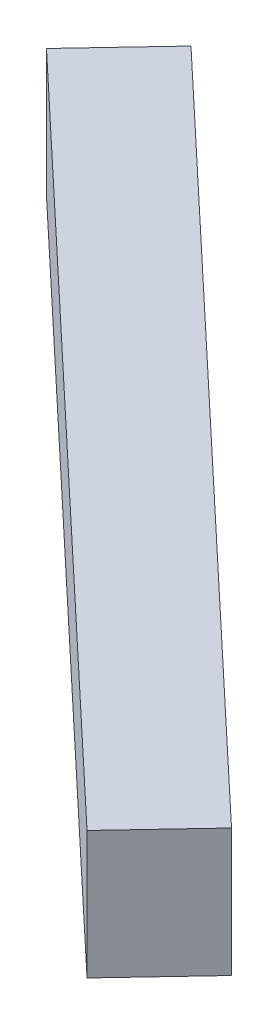
ISO-10303-21;
HEADER;
FILE_DESCRIPTION(('STEP AP214'),'2;1');
FILE_NAME('part.step','',(''),(''),'','','');
FILE_SCHEMA(('AUTOMOTIVE_DESIGN { 1 0 10303 214 1 1 1 1 }'));
ENDSEC;
DATA;
#1=APPLICATION_CONTEXT('core data for automotive mechanical design processes');
#2=APPLICATION_PROTOCOL_DEFINITION('international standard','automotive_design',2000,#1);
#3=PRODUCT_CONTEXT('',#1,'mechanical');
#4=PRODUCT('Part','Part','',(#3));
#5=PRODUCT_RELATED_PRODUCT_CATEGORY('part','',(#4));
#6=PRODUCT_DEFINITION_FORMATION('','',#4);
#7=PRODUCT_DEFINITION_CONTEXT('part definition',#1,'design');
#8=PRODUCT_DEFINITION('design','',#6,#7);
#9=PRODUCT_DEFINITION_SHAPE('','',#8);
#10=(LENGTH_UNIT() NAMED_UNIT(*) SI_UNIT(.MILLI.,.METRE.));
#11=(NAMED_UNIT(*) PLANE_ANGLE_UNIT() SI_UNIT($,.RADIAN.));
#12=(NAMED_UNIT(*) SI_UNIT($,.STERADIAN.) SOLID_ANGLE_UNIT());
#13=UNCERTAINTY_MEASURE_WITH_UNIT(LENGTH_MEASURE(1.E-05),#10,'distance_accuracy_value','');
#14=(GEOMETRIC_REPRESENTATION_CONTEXT(3) GLOBAL_UNCERTAINTY_ASSIGNED_CONTEXT((#13)) GLOBAL_UNIT_ASSIGNED_CONTEXT((#10,
#11,#12)) REPRESENTATION_CONTEXT('',''));
#15=CARTESIAN_POINT('',(0.,0.,0.));
#16=DIRECTION('',(0.,0.,1.));
#17=DIRECTION('',(1.,0.,0.));
#18=AXIS2_PLACEMENT_3D('',#15,#16,#17);
#19=CARTESIAN_POINT('',(-13.1693987770716,7.874,-12.2659159191959));
#20=DIRECTION('',(0.685632034006956,0.,-0.727948290707166));
#21=DIRECTION('',(-0.727948290707166,0.,-0.685632034006956));
#22=AXIS2_PLACEMENT_3D('',#19,#20,#21);
#23=PLANE('',#22);
#24=DIRECTION('',(0.,1.,0.));
#25=VECTOR('',#24,1.);
#26=CARTESIAN_POINT('',(-13.1693987770716,7.874,-12.2659159191959));
#27=LINE('',#26,#25);
#28=CARTESIAN_POINT('',(-13.1693987770716,7.62,-12.2659159191959));
#29=VERTEX_POINT('',#28);
#30=CARTESIAN_POINT('',(-13.1693987770716,7.874,-12.2659159191959));
#31=VERTEX_POINT('',#30);
#32=EDGE_CURVE('E20',#29,#31,#27,.T.);
#33=ORIENTED_EDGE('',*,*,#32,.T.);
#34=DIRECTION('',(-0.727948290707165,0.,-0.685632034006957));
#35=VECTOR('',#34,1.);
#36=CARTESIAN_POINT('',(-13.1693987770716,7.874,-12.2659159191959));
#37=LINE('',#36,#35);
#38=CARTESIAN_POINT('',(-14.5561402708688,7.874,-13.5720449439792));
#39=VERTEX_POINT('',#38);
#40=EDGE_CURVE('E55',#31,#39,#37,.T.);
#41=ORIENTED_EDGE('',*,*,#40,.T.);
#42=DIRECTION('',(0.,1.,0.));
#43=VECTOR('',#42,1.);
#44=CARTESIAN_POINT('',(-14.5561402708688,7.874,-13.5720449439792));
#45=LINE('',#44,#43);
#46=CARTESIAN_POINT('',(-14.5561402708688,7.62,-13.5720449439792));
#47=VERTEX_POINT('',#46);
#48=EDGE_CURVE('E76',#39,#47,#45,.F.);
#49=ORIENTED_EDGE('',*,*,#48,.T.);
#50=DIRECTION('',(-0.727948290707165,0.,-0.685632034006957));
#51=VECTOR('',#50,1.);
#52=CARTESIAN_POINT('',(-13.1693987770716,7.62,-12.2659159191959));
#53=LINE('',#52,#51);
#54=EDGE_CURVE('E58',#29,#47,#53,.T.);
#55=ORIENTED_EDGE('',*,*,#54,.F.);
#56=EDGE_LOOP('',(#33,#41,#49,#55));
#57=FACE_BOUND('',#56,.T.);
#58=ADVANCED_FACE('F17',(#57),#23,.F.);
#59=CARTESIAN_POINT('',(-13.1693987770716,7.874,-12.2659159191959));
#60=DIRECTION('',(-0.727948290707194,0.,-0.685632034006926));
#61=DIRECTION('',(-0.685632034006926,0.,0.727948290707194));
#62=AXIS2_PLACEMENT_3D('',#59,#60,#61);
#63=PLANE('',#62);
#64=DIRECTION('',(0.,1.,0.));
#65=VECTOR('',#64,1.);
#66=CARTESIAN_POINT('',(-13.0300783477614,7.874,-12.4138350118676));
#67=LINE('',#66,#65);
#68=CARTESIAN_POINT('',(-13.0300783477614,7.62,-12.4138350118676));
#69=VERTEX_POINT('',#68);
#70=CARTESIAN_POINT('',(-13.0300783477614,7.874,-12.4138350118676));
#71=VERTEX_POINT('',#70);
#72=EDGE_CURVE('E73',#69,#71,#67,.T.);
#73=ORIENTED_EDGE('',*,*,#72,.T.);
#74=DIRECTION('',(-0.685632034006912,0.,0.727948290707207));
#75=VECTOR('',#74,1.);
#76=CARTESIAN_POINT('',(-13.0300783477614,7.874,-12.4138350118676));
#77=LINE('',#76,#75);
#78=EDGE_CURVE('E63',#71,#31,#77,.T.);
#79=ORIENTED_EDGE('',*,*,#78,.T.);
#80=ORIENTED_EDGE('',*,*,#32,.F.);
#81=DIRECTION('',(-0.685632034006912,0.,0.727948290707207));
#82=VECTOR('',#81,1.);
#83=CARTESIAN_POINT('',(-13.0300783477614,7.62,-12.4138350118676));
#84=LINE('',#83,#82);
#85=EDGE_CURVE('E80',#69,#29,#84,.T.);
#86=ORIENTED_EDGE('',*,*,#85,.F.);
#87=EDGE_LOOP('',(#73,#79,#80,#86));
#88=FACE_BOUND('',#87,.T.);
#89=ADVANCED_FACE('F72',(#88),#63,.F.);
#90=CARTESIAN_POINT('',(-13.1693987770716,7.874,-12.2659159191959));
#91=DIRECTION('',(0.,-1.,0.));
#92=DIRECTION('',(0.,0.,-1.));
#93=AXIS2_PLACEMENT_3D('',#90,#91,#92);
#94=PLANE('',#93);
#95=ORIENTED_EDGE('',*,*,#78,.F.);
#96=DIRECTION('',(0.727948290707166,0.,0.685632034006955));
#97=VECTOR('',#96,1.);
#98=CARTESIAN_POINT('',(-13.0300783477614,7.874,-12.4138350118676));
#99=LINE('',#98,#97);
#100=CARTESIAN_POINT('',(-14.4168198417837,7.874,-13.719964036863));
#101=VERTEX_POINT('',#100);
#102=EDGE_CURVE('E83',#71,#101,#99,.F.);
#103=ORIENTED_EDGE('',*,*,#102,.T.);
#104=DIRECTION('',(0.685632032898792,0.,-0.727948291750911));
#105=VECTOR('',#104,1.);
#106=CARTESIAN_POINT('',(-14.5561402708688,7.874,-13.5720449439792));
#107=LINE('',#106,#105);
#108=EDGE_CURVE('E69',#101,#39,#107,.F.);
#109=ORIENTED_EDGE('',*,*,#108,.T.);
#110=ORIENTED_EDGE('',*,*,#40,.F.);
#111=EDGE_LOOP('',(#95,#103,#109,#110));
#112=FACE_BOUND('',#111,.T.);
#113=ADVANCED_FACE('F66',(#112),#94,.F.);
#114=CARTESIAN_POINT('',(-14.5561402708688,7.874,-13.5720449439792));
#115=DIRECTION('',(0.727948291750911,0.,0.685632032898792));
#116=DIRECTION('',(0.685632032898792,0.,-0.727948291750911));
#117=AXIS2_PLACEMENT_3D('',#114,#115,#116);
#118=PLANE('',#117);
#119=ORIENTED_EDGE('',*,*,#48,.F.);
#120=ORIENTED_EDGE('',*,*,#108,.F.);
#121=DIRECTION('',(0.,1.,0.));
#122=VECTOR('',#121,1.);
#123=CARTESIAN_POINT('',(-14.4168198417837,7.874,-13.719964036863));
#124=LINE('',#123,#122);
#125=CARTESIAN_POINT('',(-14.4168198417837,7.62,-13.719964036863));
#126=VERTEX_POINT('',#125);
#127=EDGE_CURVE('E26',#101,#126,#124,.F.);
#128=ORIENTED_EDGE('',*,*,#127,.T.);
#129=DIRECTION('',(0.685632032898921,0.,-0.72794829175079));
#130=VECTOR('',#129,1.);
#131=CARTESIAN_POINT('',(-14.5561402708688,7.62,-13.5720449439792));
#132=LINE('',#131,#130);
#133=EDGE_CURVE('E34',#47,#126,#132,.T.);
#134=ORIENTED_EDGE('',*,*,#133,.F.);
#135=EDGE_LOOP('',(#119,#120,#128,#134));
#136=FACE_BOUND('',#135,.T.);
#137=ADVANCED_FACE('F88',(#136),#118,.F.);
#138=CARTESIAN_POINT('',(-13.1693987770716,7.62,-12.2659159191959));
#139=DIRECTION('',(0.,-1.,0.));
#140=DIRECTION('',(0.,0.,-1.));
#141=AXIS2_PLACEMENT_3D('',#138,#139,#140);
#142=PLANE('',#141);
#143=DIRECTION('',(0.727948290707166,0.,0.685632034006955));
#144=VECTOR('',#143,1.);
#145=CARTESIAN_POINT('',(-13.0300783477614,7.62,-12.4138350118676));
#146=LINE('',#145,#144);
#147=EDGE_CURVE('E11',#126,#69,#146,.T.);
#148=ORIENTED_EDGE('',*,*,#147,.T.);
#149=ORIENTED_EDGE('',*,*,#85,.T.);
#150=ORIENTED_EDGE('',*,*,#54,.T.);
#151=ORIENTED_EDGE('',*,*,#133,.T.);
#152=EDGE_LOOP('',(#148,#149,#150,#151));
#153=FACE_BOUND('',#152,.T.);
#154=ADVANCED_FACE('F91',(#153),#142,.T.);
#155=CARTESIAN_POINT('',(-13.0300783477614,7.874,-12.4138350118676));
#156=DIRECTION('',(-0.685632034006955,0.,0.727948290707166));
#157=DIRECTION('',(0.727948290707166,0.,0.685632034006955));
#158=AXIS2_PLACEMENT_3D('',#155,#156,#157);
#159=PLANE('',#158);
#160=ORIENTED_EDGE('',*,*,#127,.F.);
#161=ORIENTED_EDGE('',*,*,#102,.F.);
#162=ORIENTED_EDGE('',*,*,#72,.F.);
#163=ORIENTED_EDGE('',*,*,#147,.F.);
#164=EDGE_LOOP('',(#160,#161,#162,#163));
#165=FACE_BOUND('',#164,.T.);
#166=ADVANCED_FACE('F90',(#165),#159,.F.);
#167=CLOSED_SHELL('',(#58,#89,#113,#137,#154,#166));
#168=MANIFOLD_SOLID_BREP('B1',#167);
#169=ADVANCED_BREP_SHAPE_REPRESENTATION('',(#18,#168),#14);
#170=SHAPE_DEFINITION_REPRESENTATION(#9,#169);
ENDSEC;
END-ISO-10303-21;
